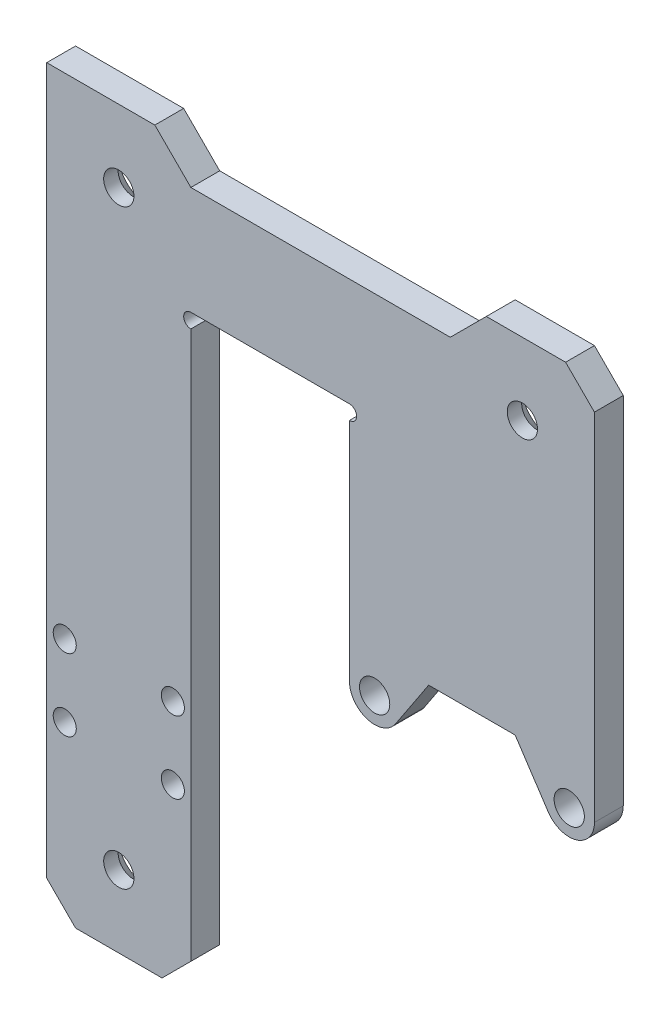
ISO-10303-21;
HEADER;
FILE_DESCRIPTION(('STEP AP214'),'2;1');
FILE_NAME('part.step','',(''),(''),'','','');
FILE_SCHEMA(('AUTOMOTIVE_DESIGN { 1 0 10303 214 1 1 1 1 }'));
ENDSEC;
DATA;
#1=APPLICATION_CONTEXT('core data for automotive mechanical design processes');
#2=APPLICATION_PROTOCOL_DEFINITION('international standard','automotive_design',2000,#1);
#3=PRODUCT_CONTEXT('',#1,'mechanical');
#4=PRODUCT('Part','Part','',(#3));
#5=PRODUCT_RELATED_PRODUCT_CATEGORY('part','',(#4));
#6=PRODUCT_DEFINITION_FORMATION('','',#4);
#7=PRODUCT_DEFINITION_CONTEXT('part definition',#1,'design');
#8=PRODUCT_DEFINITION('design','',#6,#7);
#9=PRODUCT_DEFINITION_SHAPE('','',#8);
#10=(LENGTH_UNIT() NAMED_UNIT(*) SI_UNIT(.MILLI.,.METRE.));
#11=(NAMED_UNIT(*) PLANE_ANGLE_UNIT() SI_UNIT($,.RADIAN.));
#12=(NAMED_UNIT(*) SI_UNIT($,.STERADIAN.) SOLID_ANGLE_UNIT());
#13=UNCERTAINTY_MEASURE_WITH_UNIT(LENGTH_MEASURE(1.E-05),#10,'distance_accuracy_value','');
#14=(GEOMETRIC_REPRESENTATION_CONTEXT(3) GLOBAL_UNCERTAINTY_ASSIGNED_CONTEXT((#13)) GLOBAL_UNIT_ASSIGNED_CONTEXT((#10,
#11,#12)) REPRESENTATION_CONTEXT('',''));
#15=CARTESIAN_POINT('',(0.,0.,0.));
#16=DIRECTION('',(0.,0.,1.));
#17=DIRECTION('',(1.,0.,0.));
#18=AXIS2_PLACEMENT_3D('',#15,#16,#17);
#19=CARTESIAN_POINT('',(45.,20.,2.));
#20=DIRECTION('',(0.,-1.,0.));
#21=DIRECTION('',(1.,0.,0.));
#22=AXIS2_PLACEMENT_3D('',#19,#20,#21);
#23=PLANE('',#22);
#24=DIRECTION('',(-1.,0.,0.));
#25=VECTOR('',#24,1.);
#26=CARTESIAN_POINT('',(45.,20.,2.));
#27=LINE('',#26,#25);
#28=CARTESIAN_POINT('',(41.,20.,2.));
#29=VERTEX_POINT('',#28);
#30=CARTESIAN_POINT('',(30.0000000000001,20.,2.));
#31=VERTEX_POINT('',#30);
#32=EDGE_CURVE('E265',#29,#31,#27,.T.);
#33=ORIENTED_EDGE('',*,*,#32,.F.);
#34=DIRECTION('',(0.,0.,-1.));
#35=VECTOR('',#34,1.);
#36=CARTESIAN_POINT('',(41.,20.,2.));
#37=LINE('',#36,#35);
#38=CARTESIAN_POINT('',(41.,20.,-2.));
#39=VERTEX_POINT('',#38);
#40=EDGE_CURVE('E48',#29,#39,#37,.T.);
#41=ORIENTED_EDGE('',*,*,#40,.T.);
#42=DIRECTION('',(-1.,0.,0.));
#43=VECTOR('',#42,1.);
#44=CARTESIAN_POINT('',(45.,20.,-2.));
#45=LINE('',#44,#43);
#46=CARTESIAN_POINT('',(30.0000000000001,20.,-2.));
#47=VERTEX_POINT('',#46);
#48=EDGE_CURVE('E263',#39,#47,#45,.T.);
#49=ORIENTED_EDGE('',*,*,#48,.T.);
#50=DIRECTION('',(0.,0.,1.));
#51=VECTOR('',#50,1.);
#52=CARTESIAN_POINT('',(30.0000000000001,20.,-2.));
#53=LINE('',#52,#51);
#54=EDGE_CURVE('E502',#47,#31,#53,.T.);
#55=ORIENTED_EDGE('',*,*,#54,.T.);
#56=EDGE_LOOP('',(#33,#41,#49,#55));
#57=FACE_BOUND('',#56,.T.);
#58=ADVANCED_FACE('F39',(#57),#23,.F.);
#59=CARTESIAN_POINT('',(41.5,-33.3065622090011,2.));
#60=DIRECTION('',(0.,0.,1.));
#61=DIRECTION('',(1.,0.,0.));
#62=AXIS2_PLACEMENT_3D('',#59,#60,#61);
#63=PLANE('',#62);
#64=CARTESIAN_POINT('',(-13.5,-58.,2.));
#65=DIRECTION('',(0.,0.,1.));
#66=DIRECTION('',(1.,0.,0.));
#67=AXIS2_PLACEMENT_3D('',#64,#65,#66);
#68=CIRCLE('',#67,1.6);
#69=CARTESIAN_POINT('',(-11.9,-58.,2.));
#70=VERTEX_POINT('',#69);
#71=EDGE_CURVE('E779',#70,#70,#68,.T.);
#72=ORIENTED_EDGE('',*,*,#71,.F.);
#73=EDGE_LOOP('',(#72));
#74=FACE_BOUND('',#73,.T.);
#75=CARTESIAN_POINT('',(-13.5,-48.,2.));
#76=DIRECTION('',(0.,0.,1.));
#77=DIRECTION('',(1.,0.,0.));
#78=AXIS2_PLACEMENT_3D('',#75,#76,#77);
#79=CIRCLE('',#78,1.6);
#80=CARTESIAN_POINT('',(-11.9,-48.,2.));
#81=VERTEX_POINT('',#80);
#82=EDGE_CURVE('E781',#81,#81,#79,.T.);
#83=ORIENTED_EDGE('',*,*,#82,.F.);
#84=EDGE_LOOP('',(#83));
#85=FACE_BOUND('',#84,.T.);
#86=CARTESIAN_POINT('',(-28.5,-48.,2.));
#87=DIRECTION('',(0.,0.,1.));
#88=DIRECTION('',(1.,0.,0.));
#89=AXIS2_PLACEMENT_3D('',#86,#87,#88);
#90=CIRCLE('',#89,1.6);
#91=CARTESIAN_POINT('',(-26.9,-48.,2.));
#92=VERTEX_POINT('',#91);
#93=EDGE_CURVE('E792',#92,#92,#90,.T.);
#94=ORIENTED_EDGE('',*,*,#93,.F.);
#95=EDGE_LOOP('',(#94));
#96=FACE_BOUND('',#95,.T.);
#97=CARTESIAN_POINT('',(-28.5,-58.,2.));
#98=DIRECTION('',(0.,0.,1.));
#99=DIRECTION('',(1.,0.,0.));
#100=AXIS2_PLACEMENT_3D('',#97,#98,#99);
#101=CIRCLE('',#100,1.6);
#102=CARTESIAN_POINT('',(-26.9,-58.,2.));
#103=VERTEX_POINT('',#102);
#104=EDGE_CURVE('E484',#103,#103,#101,.T.);
#105=ORIENTED_EDGE('',*,*,#104,.F.);
#106=EDGE_LOOP('',(#105));
#107=FACE_BOUND('',#106,.T.);
#108=DIRECTION('',(0.,-1.,0.));
#109=VECTOR('',#108,1.);
#110=CARTESIAN_POINT('',(-31.,20.,2.));
#111=LINE('',#110,#109);
#112=CARTESIAN_POINT('',(-31.,20.,2.));
#113=VERTEX_POINT('',#112);
#114=CARTESIAN_POINT('',(-31.,-78.,2.));
#115=VERTEX_POINT('',#114);
#116=EDGE_CURVE('E378',#113,#115,#111,.T.);
#117=ORIENTED_EDGE('',*,*,#116,.T.);
#118=DIRECTION('',(-0.707106781186546,0.707106781186549,0.));
#119=VECTOR('',#118,1.);
#120=CARTESIAN_POINT('',(-17.0967188954995,-91.9032811045005,2.));
#121=LINE('',#120,#119);
#122=CARTESIAN_POINT('',(-27.,-82.,2.));
#123=VERTEX_POINT('',#122);
#124=EDGE_CURVE('E254',#115,#123,#121,.F.);
#125=ORIENTED_EDGE('',*,*,#124,.T.);
#126=DIRECTION('',(1.,0.,0.));
#127=VECTOR('',#126,1.);
#128=CARTESIAN_POINT('',(-31.,-82.,2.));
#129=LINE('',#128,#127);
#130=CARTESIAN_POINT('',(-15.,-82.,2.));
#131=VERTEX_POINT('',#130);
#132=EDGE_CURVE('E293',#123,#131,#129,.T.);
#133=ORIENTED_EDGE('',*,*,#132,.T.);
#134=DIRECTION('',(-0.707106781186549,-0.707106781186546,0.));
#135=VECTOR('',#134,1.);
#136=CARTESIAN_POINT('',(37.5967188954995,-29.4032811045006,2.));
#137=LINE('',#136,#135);
#138=CARTESIAN_POINT('',(-11.,-78.,2.));
#139=VERTEX_POINT('',#138);
#140=EDGE_CURVE('E55',#131,#139,#137,.F.);
#141=ORIENTED_EDGE('',*,*,#140,.T.);
#142=DIRECTION('',(0.,1.,0.));
#143=VECTOR('',#142,1.);
#144=CARTESIAN_POINT('',(-11.,0.,2.));
#145=LINE('',#144,#143);
#146=CARTESIAN_POINT('',(-11.,-2.,2.));
#147=VERTEX_POINT('',#146);
#148=EDGE_CURVE('E205',#139,#147,#145,.T.);
#149=ORIENTED_EDGE('',*,*,#148,.T.);
#150=CARTESIAN_POINT('',(-11.,-1.,2.));
#151=DIRECTION('',(0.,0.,1.));
#152=DIRECTION('',(1.,0.,0.));
#153=AXIS2_PLACEMENT_3D('',#150,#151,#152);
#154=CIRCLE('',#153,1.);
#155=CARTESIAN_POINT('',(-11.,0.,2.));
#156=VERTEX_POINT('',#155);
#157=EDGE_CURVE('E201',#156,#147,#154,.T.);
#158=ORIENTED_EDGE('',*,*,#157,.F.);
#159=DIRECTION('',(1.,0.,0.));
#160=VECTOR('',#159,1.);
#161=CARTESIAN_POINT('',(11.,0.,2.));
#162=LINE('',#161,#160);
#163=CARTESIAN_POINT('',(11.,0.,2.));
#164=VERTEX_POINT('',#163);
#165=EDGE_CURVE('E196',#156,#164,#162,.T.);
#166=ORIENTED_EDGE('',*,*,#165,.T.);
#167=CARTESIAN_POINT('',(11.,-0.999999999999996,2.));
#168=DIRECTION('',(0.,0.,1.));
#169=DIRECTION('',(1.,0.,0.));
#170=AXIS2_PLACEMENT_3D('',#167,#168,#169);
#171=CIRCLE('',#170,1.);
#172=CARTESIAN_POINT('',(11.,-2.,2.));
#173=VERTEX_POINT('',#172);
#174=EDGE_CURVE('E182',#173,#164,#171,.T.);
#175=ORIENTED_EDGE('',*,*,#174,.F.);
#176=DIRECTION('',(0.,-1.,0.));
#177=VECTOR('',#176,1.);
#178=CARTESIAN_POINT('',(11.,0.,2.));
#179=LINE('',#178,#177);
#180=CARTESIAN_POINT('',(11.,-33.3065622090011,2.));
#181=VERTEX_POINT('',#180);
#182=EDGE_CURVE('E204',#173,#181,#179,.T.);
#183=ORIENTED_EDGE('',*,*,#182,.T.);
#184=CARTESIAN_POINT('',(14.5,-33.3065622090011,2.));
#185=DIRECTION('',(0.,0.,1.));
#186=DIRECTION('',(1.,0.,0.));
#187=AXIS2_PLACEMENT_3D('',#184,#185,#186);
#188=CIRCLE('',#187,3.5);
#189=CARTESIAN_POINT('',(17.4198882166285,-35.2363945339439,2.));
#190=VERTEX_POINT('',#189);
#191=EDGE_CURVE('E392',#181,#190,#188,.T.);
#192=ORIENTED_EDGE('',*,*,#191,.T.);
#193=DIRECTION('',(0.551380664269361,0.834253776179574,0.));
#194=VECTOR('',#193,1.);
#195=CARTESIAN_POINT('',(17.4198882166285,-35.2363945339439,2.));
#196=LINE('',#195,#194);
#197=CARTESIAN_POINT('',(22.,-28.3065622090011,2.));
#198=VERTEX_POINT('',#197);
#199=EDGE_CURVE('E312',#190,#198,#196,.T.);
#200=ORIENTED_EDGE('',*,*,#199,.T.);
#201=DIRECTION('',(1.,0.,0.));
#202=VECTOR('',#201,1.);
#203=CARTESIAN_POINT('',(22.,-28.3065622090011,2.));
#204=LINE('',#203,#202);
#205=CARTESIAN_POINT('',(34.,-28.3065622090011,2.));
#206=VERTEX_POINT('',#205);
#207=EDGE_CURVE('E394',#198,#206,#204,.T.);
#208=ORIENTED_EDGE('',*,*,#207,.T.);
#209=DIRECTION('',(0.551380664269361,-0.834253776179574,0.));
#210=VECTOR('',#209,1.);
#211=CARTESIAN_POINT('',(38.5801117833715,-35.2363945339439,2.));
#212=LINE('',#211,#210);
#213=CARTESIAN_POINT('',(38.5801117833715,-35.2363945339439,2.));
#214=VERTEX_POINT('',#213);
#215=EDGE_CURVE('E399',#206,#214,#212,.T.);
#216=ORIENTED_EDGE('',*,*,#215,.T.);
#217=CARTESIAN_POINT('',(41.5,-33.3065622090011,2.));
#218=DIRECTION('',(0.,0.,1.));
#219=DIRECTION('',(1.,0.,0.));
#220=AXIS2_PLACEMENT_3D('',#217,#218,#219);
#221=CIRCLE('',#220,3.5);
#222=CARTESIAN_POINT('',(45.,-33.3065622090011,2.));
#223=VERTEX_POINT('',#222);
#224=EDGE_CURVE('E379',#214,#223,#221,.T.);
#225=ORIENTED_EDGE('',*,*,#224,.T.);
#226=DIRECTION('',(0.,1.,0.));
#227=VECTOR('',#226,1.);
#228=CARTESIAN_POINT('',(45.,-33.3065622090011,2.));
#229=LINE('',#228,#227);
#230=CARTESIAN_POINT('',(45.,16.,2.));
#231=VERTEX_POINT('',#230);
#232=EDGE_CURVE('E376',#223,#231,#229,.T.);
#233=ORIENTED_EDGE('',*,*,#232,.T.);
#234=DIRECTION('',(0.707106781186546,-0.707106781186549,0.));
#235=VECTOR('',#234,1.);
#236=CARTESIAN_POINT('',(67.9032811045006,-6.90328110450067,2.));
#237=LINE('',#236,#235);
#238=EDGE_CURVE('E62',#231,#29,#237,.F.);
#239=ORIENTED_EDGE('',*,*,#238,.T.);
#240=ORIENTED_EDGE('',*,*,#32,.T.);
#241=DIRECTION('',(0.707106781186552,0.707106781186543,0.));
#242=VECTOR('',#241,1.);
#243=CARTESIAN_POINT('',(25.,15.,2.));
#244=LINE('',#243,#242);
#245=CARTESIAN_POINT('',(25.,15.,2.));
#246=VERTEX_POINT('',#245);
#247=EDGE_CURVE('E492',#246,#31,#244,.T.);
#248=ORIENTED_EDGE('',*,*,#247,.F.);
#249=DIRECTION('',(1.,0.,0.));
#250=VECTOR('',#249,1.);
#251=CARTESIAN_POINT('',(-11.,15.,2.));
#252=LINE('',#251,#250);
#253=CARTESIAN_POINT('',(-11.,15.,2.));
#254=VERTEX_POINT('',#253);
#255=EDGE_CURVE('E497',#254,#246,#252,.T.);
#256=ORIENTED_EDGE('',*,*,#255,.F.);
#257=DIRECTION('',(0.707106781186552,-0.707106781186544,0.));
#258=VECTOR('',#257,1.);
#259=CARTESIAN_POINT('',(-16.0000000000001,20.,2.));
#260=LINE('',#259,#258);
#261=CARTESIAN_POINT('',(-16.0000000000001,20.,2.));
#262=VERTEX_POINT('',#261);
#263=EDGE_CURVE('E480',#262,#254,#260,.T.);
#264=ORIENTED_EDGE('',*,*,#263,.F.);
#265=EDGE_CURVE('E371',#262,#113,#27,.T.);
#266=ORIENTED_EDGE('',*,*,#265,.T.);
#267=EDGE_LOOP('',(#117,#125,#133,#141,#149,#158,#166,#175,#183,#192,#200,#208,#216,#225,#233,
#239,#240,#248,#256,#264,#266));
#268=FACE_BOUND('',#267,.T.);
#269=CARTESIAN_POINT('',(41.5,-33.3065622090011,2.));
#270=DIRECTION('',(0.,0.,1.));
#271=DIRECTION('',(1.,0.,0.));
#272=AXIS2_PLACEMENT_3D('',#269,#270,#271);
#273=CIRCLE('',#272,2.1);
#274=CARTESIAN_POINT('',(43.6,-33.3065622090011,2.));
#275=VERTEX_POINT('',#274);
#276=EDGE_CURVE('E513',#275,#275,#273,.T.);
#277=ORIENTED_EDGE('',*,*,#276,.F.);
#278=EDGE_LOOP('',(#277));
#279=FACE_BOUND('',#278,.T.);
#280=CARTESIAN_POINT('',(35.,10.,2.));
#281=DIRECTION('',(0.,0.,1.));
#282=DIRECTION('',(1.,0.,0.));
#283=AXIS2_PLACEMENT_3D('',#280,#281,#282);
#284=CIRCLE('',#283,2.1);
#285=CARTESIAN_POINT('',(37.1,10.,2.));
#286=VERTEX_POINT('',#285);
#287=EDGE_CURVE('E522',#286,#286,#284,.T.);
#288=ORIENTED_EDGE('',*,*,#287,.F.);
#289=EDGE_LOOP('',(#288));
#290=FACE_BOUND('',#289,.T.);
#291=CARTESIAN_POINT('',(-21.,10.,2.));
#292=DIRECTION('',(0.,0.,1.));
#293=DIRECTION('',(1.,0.,0.));
#294=AXIS2_PLACEMENT_3D('',#291,#292,#293);
#295=CIRCLE('',#294,2.1);
#296=CARTESIAN_POINT('',(-18.9,10.,2.));
#297=VERTEX_POINT('',#296);
#298=EDGE_CURVE('E387',#297,#297,#295,.T.);
#299=ORIENTED_EDGE('',*,*,#298,.F.);
#300=EDGE_LOOP('',(#299));
#301=FACE_BOUND('',#300,.T.);
#302=CARTESIAN_POINT('',(14.5,-33.3065622090011,2.));
#303=DIRECTION('',(0.,0.,1.));
#304=DIRECTION('',(1.,0.,0.));
#305=AXIS2_PLACEMENT_3D('',#302,#303,#304);
#306=CIRCLE('',#305,2.09999999999999);
#307=CARTESIAN_POINT('',(16.6,-33.3065622090011,2.));
#308=VERTEX_POINT('',#307);
#309=EDGE_CURVE('E519',#308,#308,#306,.T.);
#310=ORIENTED_EDGE('',*,*,#309,.F.);
#311=EDGE_LOOP('',(#310));
#312=FACE_BOUND('',#311,.T.);
#313=CARTESIAN_POINT('',(-21.,-72.,2.));
#314=DIRECTION('',(0.,0.,1.));
#315=DIRECTION('',(1.,0.,0.));
#316=AXIS2_PLACEMENT_3D('',#313,#314,#315);
#317=CIRCLE('',#316,2.1);
#318=CARTESIAN_POINT('',(-18.9,-72.,2.));
#319=VERTEX_POINT('',#318);
#320=EDGE_CURVE('E504',#319,#319,#317,.T.);
#321=ORIENTED_EDGE('',*,*,#320,.F.);
#322=EDGE_LOOP('',(#321));
#323=FACE_BOUND('',#322,.T.);
#324=ADVANCED_FACE('F198',(#74,#85,#96,#107,#268,#279,#290,#301,#312,#323),#63,.T.);
#325=CARTESIAN_POINT('',(41.5,-33.3065622090011,-2.));
#326=DIRECTION('',(0.,0.,1.));
#327=DIRECTION('',(1.,0.,0.));
#328=AXIS2_PLACEMENT_3D('',#325,#326,#327);
#329=PLANE('',#328);
#330=CARTESIAN_POINT('',(-13.5,-58.,-2.));
#331=DIRECTION('',(0.,0.,1.));
#332=DIRECTION('',(1.,0.,0.));
#333=AXIS2_PLACEMENT_3D('',#330,#331,#332);
#334=CIRCLE('',#333,1.6);
#335=CARTESIAN_POINT('',(-11.9,-58.,-2.));
#336=VERTEX_POINT('',#335);
#337=EDGE_CURVE('E776',#336,#336,#334,.T.);
#338=ORIENTED_EDGE('',*,*,#337,.T.);
#339=EDGE_LOOP('',(#338));
#340=FACE_BOUND('',#339,.T.);
#341=CARTESIAN_POINT('',(-13.5,-48.,-2.));
#342=DIRECTION('',(0.,0.,1.));
#343=DIRECTION('',(1.,0.,0.));
#344=AXIS2_PLACEMENT_3D('',#341,#342,#343);
#345=CIRCLE('',#344,1.6);
#346=CARTESIAN_POINT('',(-11.9,-48.,-2.));
#347=VERTEX_POINT('',#346);
#348=EDGE_CURVE('E797',#347,#347,#345,.T.);
#349=ORIENTED_EDGE('',*,*,#348,.T.);
#350=EDGE_LOOP('',(#349));
#351=FACE_BOUND('',#350,.T.);
#352=CARTESIAN_POINT('',(-28.5,-48.,-2.));
#353=DIRECTION('',(0.,0.,1.));
#354=DIRECTION('',(1.,0.,0.));
#355=AXIS2_PLACEMENT_3D('',#352,#353,#354);
#356=CIRCLE('',#355,1.6);
#357=CARTESIAN_POINT('',(-26.9,-48.,-2.));
#358=VERTEX_POINT('',#357);
#359=EDGE_CURVE('E788',#358,#358,#356,.T.);
#360=ORIENTED_EDGE('',*,*,#359,.T.);
#361=EDGE_LOOP('',(#360));
#362=FACE_BOUND('',#361,.T.);
#363=CARTESIAN_POINT('',(-28.5,-58.,-2.));
#364=DIRECTION('',(0.,0.,1.));
#365=DIRECTION('',(1.,0.,0.));
#366=AXIS2_PLACEMENT_3D('',#363,#364,#365);
#367=CIRCLE('',#366,1.6);
#368=CARTESIAN_POINT('',(-26.9,-58.,-2.));
#369=VERTEX_POINT('',#368);
#370=EDGE_CURVE('E192',#369,#369,#367,.T.);
#371=ORIENTED_EDGE('',*,*,#370,.T.);
#372=EDGE_LOOP('',(#371));
#373=FACE_BOUND('',#372,.T.);
#374=CARTESIAN_POINT('',(35.,10.,-2.));
#375=DIRECTION('',(0.,0.,1.));
#376=DIRECTION('',(1.,0.,0.));
#377=AXIS2_PLACEMENT_3D('',#374,#375,#376);
#378=CIRCLE('',#377,4.09999999999998);
#379=CARTESIAN_POINT('',(39.1,10.,-2.));
#380=VERTEX_POINT('',#379);
#381=EDGE_CURVE('E226',#380,#380,#378,.T.);
#382=ORIENTED_EDGE('',*,*,#381,.T.);
#383=EDGE_LOOP('',(#382));
#384=FACE_BOUND('',#383,.T.);
#385=CARTESIAN_POINT('',(-21.,10.,-2.));
#386=DIRECTION('',(0.,0.,1.));
#387=DIRECTION('',(1.,0.,0.));
#388=AXIS2_PLACEMENT_3D('',#385,#386,#387);
#389=CIRCLE('',#388,4.09999999999999);
#390=CARTESIAN_POINT('',(-16.9,10.,-2.));
#391=VERTEX_POINT('',#390);
#392=EDGE_CURVE('E223',#391,#391,#389,.T.);
#393=ORIENTED_EDGE('',*,*,#392,.T.);
#394=EDGE_LOOP('',(#393));
#395=FACE_BOUND('',#394,.T.);
#396=CARTESIAN_POINT('',(-21.,-72.,-2.));
#397=DIRECTION('',(0.,0.,1.));
#398=DIRECTION('',(1.,0.,0.));
#399=AXIS2_PLACEMENT_3D('',#396,#397,#398);
#400=CIRCLE('',#399,4.09999999999999);
#401=CARTESIAN_POINT('',(-16.9,-72.,-2.));
#402=VERTEX_POINT('',#401);
#403=EDGE_CURVE('E214',#402,#402,#400,.T.);
#404=ORIENTED_EDGE('',*,*,#403,.T.);
#405=EDGE_LOOP('',(#404));
#406=FACE_BOUND('',#405,.T.);
#407=DIRECTION('',(1.,0.,0.));
#408=VECTOR('',#407,1.);
#409=CARTESIAN_POINT('',(-31.,-82.,-2.));
#410=LINE('',#409,#408);
#411=CARTESIAN_POINT('',(-27.,-82.,-2.));
#412=VERTEX_POINT('',#411);
#413=CARTESIAN_POINT('',(-15.,-82.,-2.));
#414=VERTEX_POINT('',#413);
#415=EDGE_CURVE('E281',#412,#414,#410,.T.);
#416=ORIENTED_EDGE('',*,*,#415,.F.);
#417=DIRECTION('',(0.707106781186546,-0.707106781186549,0.));
#418=VECTOR('',#417,1.);
#419=CARTESIAN_POINT('',(-27.,-82.,-2.));
#420=LINE('',#419,#418);
#421=CARTESIAN_POINT('',(-31.,-78.,-2.));
#422=VERTEX_POINT('',#421);
#423=EDGE_CURVE('E248',#412,#422,#420,.F.);
#424=ORIENTED_EDGE('',*,*,#423,.T.);
#425=DIRECTION('',(0.,-1.,0.));
#426=VECTOR('',#425,1.);
#427=CARTESIAN_POINT('',(-31.,20.,-2.));
#428=LINE('',#427,#426);
#429=CARTESIAN_POINT('',(-31.,20.,-2.));
#430=VERTEX_POINT('',#429);
#431=EDGE_CURVE('E277',#430,#422,#428,.T.);
#432=ORIENTED_EDGE('',*,*,#431,.F.);
#433=CARTESIAN_POINT('',(-16.0000000000001,20.,-2.));
#434=VERTEX_POINT('',#433);
#435=EDGE_CURVE('E278',#434,#430,#45,.T.);
#436=ORIENTED_EDGE('',*,*,#435,.F.);
#437=DIRECTION('',(0.707106781186552,-0.707106781186544,0.));
#438=VECTOR('',#437,1.);
#439=CARTESIAN_POINT('',(-16.0000000000001,20.,-2.));
#440=LINE('',#439,#438);
#441=CARTESIAN_POINT('',(-11.,15.,-2.));
#442=VERTEX_POINT('',#441);
#443=EDGE_CURVE('E488',#434,#442,#440,.T.);
#444=ORIENTED_EDGE('',*,*,#443,.T.);
#445=DIRECTION('',(1.,0.,0.));
#446=VECTOR('',#445,1.);
#447=CARTESIAN_POINT('',(-11.,15.,-2.));
#448=LINE('',#447,#446);
#449=CARTESIAN_POINT('',(25.,15.,-2.));
#450=VERTEX_POINT('',#449);
#451=EDGE_CURVE('E491',#442,#450,#448,.T.);
#452=ORIENTED_EDGE('',*,*,#451,.T.);
#453=DIRECTION('',(0.707106781186552,0.707106781186543,0.));
#454=VECTOR('',#453,1.);
#455=CARTESIAN_POINT('',(25.,15.,-2.));
#456=LINE('',#455,#454);
#457=EDGE_CURVE('E276',#450,#47,#456,.T.);
#458=ORIENTED_EDGE('',*,*,#457,.T.);
#459=ORIENTED_EDGE('',*,*,#48,.F.);
#460=DIRECTION('',(-0.707106781186546,0.707106781186549,0.));
#461=VECTOR('',#460,1.);
#462=CARTESIAN_POINT('',(41.,20.,-2.));
#463=LINE('',#462,#461);
#464=CARTESIAN_POINT('',(45.,16.,-2.));
#465=VERTEX_POINT('',#464);
#466=EDGE_CURVE('E244',#39,#465,#463,.F.);
#467=ORIENTED_EDGE('',*,*,#466,.T.);
#468=DIRECTION('',(0.,1.,0.));
#469=VECTOR('',#468,1.);
#470=CARTESIAN_POINT('',(45.,-33.3065622090011,-2.));
#471=LINE('',#470,#469);
#472=CARTESIAN_POINT('',(45.,-33.3065622090011,-2.));
#473=VERTEX_POINT('',#472);
#474=EDGE_CURVE('E283',#473,#465,#471,.T.);
#475=ORIENTED_EDGE('',*,*,#474,.F.);
#476=CARTESIAN_POINT('',(41.5,-33.3065622090011,-2.));
#477=DIRECTION('',(0.,0.,1.));
#478=DIRECTION('',(1.,0.,0.));
#479=AXIS2_PLACEMENT_3D('',#476,#477,#478);
#480=CIRCLE('',#479,3.5);
#481=CARTESIAN_POINT('',(38.5801117833715,-35.2363945339439,-2.));
#482=VERTEX_POINT('',#481);
#483=EDGE_CURVE('E328',#482,#473,#480,.T.);
#484=ORIENTED_EDGE('',*,*,#483,.F.);
#485=DIRECTION('',(0.551380664269361,-0.834253776179574,0.));
#486=VECTOR('',#485,1.);
#487=CARTESIAN_POINT('',(38.5801117833715,-35.2363945339439,-2.));
#488=LINE('',#487,#486);
#489=CARTESIAN_POINT('',(34.,-28.3065622090011,-2.));
#490=VERTEX_POINT('',#489);
#491=EDGE_CURVE('E322',#490,#482,#488,.T.);
#492=ORIENTED_EDGE('',*,*,#491,.F.);
#493=DIRECTION('',(1.,0.,0.));
#494=VECTOR('',#493,1.);
#495=CARTESIAN_POINT('',(22.,-28.3065622090011,-2.));
#496=LINE('',#495,#494);
#497=CARTESIAN_POINT('',(22.,-28.3065622090011,-2.));
#498=VERTEX_POINT('',#497);
#499=EDGE_CURVE('E320',#498,#490,#496,.T.);
#500=ORIENTED_EDGE('',*,*,#499,.F.);
#501=DIRECTION('',(0.551380664269361,0.834253776179574,0.));
#502=VECTOR('',#501,1.);
#503=CARTESIAN_POINT('',(17.4198882166285,-35.2363945339439,-2.));
#504=LINE('',#503,#502);
#505=CARTESIAN_POINT('',(17.4198882166285,-35.2363945339439,-2.));
#506=VERTEX_POINT('',#505);
#507=EDGE_CURVE('E311',#506,#498,#504,.T.);
#508=ORIENTED_EDGE('',*,*,#507,.F.);
#509=CARTESIAN_POINT('',(14.5,-33.3065622090011,-2.));
#510=DIRECTION('',(0.,0.,1.));
#511=DIRECTION('',(1.,0.,0.));
#512=AXIS2_PLACEMENT_3D('',#509,#510,#511);
#513=CIRCLE('',#512,3.5);
#514=CARTESIAN_POINT('',(11.,-33.3065622090011,-2.));
#515=VERTEX_POINT('',#514);
#516=EDGE_CURVE('E318',#515,#506,#513,.T.);
#517=ORIENTED_EDGE('',*,*,#516,.F.);
#518=DIRECTION('',(0.,-1.,0.));
#519=VECTOR('',#518,1.);
#520=CARTESIAN_POINT('',(11.,0.,-2.));
#521=LINE('',#520,#519);
#522=CARTESIAN_POINT('',(11.,-2.,-2.));
#523=VERTEX_POINT('',#522);
#524=EDGE_CURVE('E324',#523,#515,#521,.T.);
#525=ORIENTED_EDGE('',*,*,#524,.F.);
#526=CARTESIAN_POINT('',(11.,-0.999999999999996,-2.));
#527=DIRECTION('',(0.,0.,1.));
#528=DIRECTION('',(1.,0.,0.));
#529=AXIS2_PLACEMENT_3D('',#526,#527,#528);
#530=CIRCLE('',#529,1.);
#531=CARTESIAN_POINT('',(11.,0.,-2.));
#532=VERTEX_POINT('',#531);
#533=EDGE_CURVE('E191',#523,#532,#530,.T.);
#534=ORIENTED_EDGE('',*,*,#533,.T.);
#535=DIRECTION('',(1.,0.,0.));
#536=VECTOR('',#535,1.);
#537=CARTESIAN_POINT('',(11.,0.,-2.));
#538=LINE('',#537,#536);
#539=CARTESIAN_POINT('',(-11.,0.,-2.));
#540=VERTEX_POINT('',#539);
#541=EDGE_CURVE('E210',#540,#532,#538,.T.);
#542=ORIENTED_EDGE('',*,*,#541,.F.);
#543=CARTESIAN_POINT('',(-11.,-1.,-2.));
#544=DIRECTION('',(0.,0.,1.));
#545=DIRECTION('',(1.,0.,0.));
#546=AXIS2_PLACEMENT_3D('',#543,#544,#545);
#547=CIRCLE('',#546,1.);
#548=CARTESIAN_POINT('',(-11.,-2.,-2.));
#549=VERTEX_POINT('',#548);
#550=EDGE_CURVE('E477',#540,#549,#547,.T.);
#551=ORIENTED_EDGE('',*,*,#550,.T.);
#552=DIRECTION('',(0.,1.,0.));
#553=VECTOR('',#552,1.);
#554=CARTESIAN_POINT('',(-11.,0.,-2.));
#555=LINE('',#554,#553);
#556=CARTESIAN_POINT('',(-11.,-78.,-2.));
#557=VERTEX_POINT('',#556);
#558=EDGE_CURVE('E385',#557,#549,#555,.T.);
#559=ORIENTED_EDGE('',*,*,#558,.F.);
#560=DIRECTION('',(0.707106781186549,0.707106781186546,0.));
#561=VECTOR('',#560,1.);
#562=CARTESIAN_POINT('',(-11.,-78.,-2.));
#563=LINE('',#562,#561);
#564=EDGE_CURVE('E246',#557,#414,#563,.F.);
#565=ORIENTED_EDGE('',*,*,#564,.T.);
#566=EDGE_LOOP('',(#416,#424,#432,#436,#444,#452,#458,#459,#467,#475,#484,#492,#500,#508,#517,
#525,#534,#542,#551,#559,#565));
#567=FACE_BOUND('',#566,.T.);
#568=CARTESIAN_POINT('',(14.5,-33.3065622090011,-2.));
#569=DIRECTION('',(0.,0.,1.));
#570=DIRECTION('',(1.,0.,0.));
#571=AXIS2_PLACEMENT_3D('',#568,#569,#570);
#572=CIRCLE('',#571,2.09999999999999);
#573=CARTESIAN_POINT('',(16.6,-33.3065622090011,-2.));
#574=VERTEX_POINT('',#573);
#575=EDGE_CURVE('E516',#574,#574,#572,.T.);
#576=ORIENTED_EDGE('',*,*,#575,.T.);
#577=EDGE_LOOP('',(#576));
#578=FACE_BOUND('',#577,.T.);
#579=CARTESIAN_POINT('',(41.5,-33.3065622090011,-2.));
#580=DIRECTION('',(0.,0.,1.));
#581=DIRECTION('',(1.,0.,0.));
#582=AXIS2_PLACEMENT_3D('',#579,#580,#581);
#583=CIRCLE('',#582,2.1);
#584=CARTESIAN_POINT('',(43.6,-33.3065622090011,-2.));
#585=VERTEX_POINT('',#584);
#586=EDGE_CURVE('E512',#585,#585,#583,.T.);
#587=ORIENTED_EDGE('',*,*,#586,.T.);
#588=EDGE_LOOP('',(#587));
#589=FACE_BOUND('',#588,.T.);
#590=ADVANCED_FACE('F270',(#340,#351,#362,#373,#384,#395,#406,#567,#578,#589),#329,.F.);
#591=CARTESIAN_POINT('',(-11.,0.,2.));
#592=DIRECTION('',(-1.,0.,0.));
#593=DIRECTION('',(0.,-1.,0.));
#594=AXIS2_PLACEMENT_3D('',#591,#592,#593);
#595=PLANE('',#594);
#596=ORIENTED_EDGE('',*,*,#148,.F.);
#597=DIRECTION('',(0.,0.,-1.));
#598=VECTOR('',#597,1.);
#599=CARTESIAN_POINT('',(-11.,-78.,2.));
#600=LINE('',#599,#598);
#601=EDGE_CURVE('E256',#139,#557,#600,.T.);
#602=ORIENTED_EDGE('',*,*,#601,.T.);
#603=ORIENTED_EDGE('',*,*,#558,.T.);
#604=DIRECTION('',(0.,0.,1.));
#605=VECTOR('',#604,1.);
#606=CARTESIAN_POINT('',(-11.,-2.,-2.));
#607=LINE('',#606,#605);
#608=EDGE_CURVE('E478',#549,#147,#607,.T.);
#609=ORIENTED_EDGE('',*,*,#608,.T.);
#610=EDGE_LOOP('',(#596,#602,#603,#609));
#611=FACE_BOUND('',#610,.T.);
#612=ADVANCED_FACE('F424',(#611),#595,.F.);
#613=CARTESIAN_POINT('',(11.,0.,2.));
#614=DIRECTION('',(0.,1.,0.));
#615=DIRECTION('',(-1.,0.,0.));
#616=AXIS2_PLACEMENT_3D('',#613,#614,#615);
#617=PLANE('',#616);
#618=ORIENTED_EDGE('',*,*,#541,.T.);
#619=DIRECTION('',(0.,0.,-1.));
#620=VECTOR('',#619,1.);
#621=CARTESIAN_POINT('',(11.,0.,2.));
#622=LINE('',#621,#620);
#623=EDGE_CURVE('E186',#164,#532,#622,.T.);
#624=ORIENTED_EDGE('',*,*,#623,.F.);
#625=ORIENTED_EDGE('',*,*,#165,.F.);
#626=DIRECTION('',(0.,0.,-1.));
#627=VECTOR('',#626,1.);
#628=CARTESIAN_POINT('',(-11.,0.,2.));
#629=LINE('',#628,#627);
#630=EDGE_CURVE('E211',#156,#540,#629,.T.);
#631=ORIENTED_EDGE('',*,*,#630,.T.);
#632=EDGE_LOOP('',(#618,#624,#625,#631));
#633=FACE_BOUND('',#632,.T.);
#634=ADVANCED_FACE('F208',(#633),#617,.F.);
#635=CARTESIAN_POINT('',(11.,0.,2.));
#636=DIRECTION('',(1.,0.,0.));
#637=DIRECTION('',(0.,1.,0.));
#638=AXIS2_PLACEMENT_3D('',#635,#636,#637);
#639=PLANE('',#638);
#640=ORIENTED_EDGE('',*,*,#182,.F.);
#641=DIRECTION('',(0.,0.,1.));
#642=VECTOR('',#641,1.);
#643=CARTESIAN_POINT('',(11.,-2.,-2.));
#644=LINE('',#643,#642);
#645=EDGE_CURVE('E189',#173,#523,#644,.F.);
#646=ORIENTED_EDGE('',*,*,#645,.T.);
#647=ORIENTED_EDGE('',*,*,#524,.T.);
#648=DIRECTION('',(0.,0.,-1.));
#649=VECTOR('',#648,1.);
#650=CARTESIAN_POINT('',(11.,-33.3065622090011,2.));
#651=LINE('',#650,#649);
#652=EDGE_CURVE('E212',#181,#515,#651,.T.);
#653=ORIENTED_EDGE('',*,*,#652,.F.);
#654=EDGE_LOOP('',(#640,#646,#647,#653));
#655=FACE_BOUND('',#654,.T.);
#656=ADVANCED_FACE('F390',(#655),#639,.F.);
#657=CARTESIAN_POINT('',(14.5,-33.3065622090011,2.));
#658=DIRECTION('',(0.,0.,-1.));
#659=DIRECTION('',(-1.,0.,0.));
#660=AXIS2_PLACEMENT_3D('',#657,#658,#659);
#661=CYLINDRICAL_SURFACE('',#660,3.5);
#662=ORIENTED_EDGE('',*,*,#516,.T.);
#663=DIRECTION('',(0.,0.,-1.));
#664=VECTOR('',#663,1.);
#665=CARTESIAN_POINT('',(17.4198882166285,-35.2363945339439,2.));
#666=LINE('',#665,#664);
#667=EDGE_CURVE('E217',#190,#506,#666,.T.);
#668=ORIENTED_EDGE('',*,*,#667,.F.);
#669=ORIENTED_EDGE('',*,*,#191,.F.);
#670=ORIENTED_EDGE('',*,*,#652,.T.);
#671=EDGE_LOOP('',(#662,#668,#669,#670));
#672=FACE_BOUND('',#671,.T.);
#673=ADVANCED_FACE('F391',(#672),#661,.T.);
#674=CARTESIAN_POINT('',(17.4198882166285,-35.2363945339439,2.));
#675=DIRECTION('',(-0.834253776179574,0.551380664269361,0.));
#676=DIRECTION('',(-0.551380664269361,-0.834253776179574,0.));
#677=AXIS2_PLACEMENT_3D('',#674,#675,#676);
#678=PLANE('',#677);
#679=ORIENTED_EDGE('',*,*,#507,.T.);
#680=DIRECTION('',(0.,0.,-1.));
#681=VECTOR('',#680,1.);
#682=CARTESIAN_POINT('',(22.,-28.3065622090011,2.));
#683=LINE('',#682,#681);
#684=EDGE_CURVE('E302',#198,#498,#683,.T.);
#685=ORIENTED_EDGE('',*,*,#684,.F.);
#686=ORIENTED_EDGE('',*,*,#199,.F.);
#687=ORIENTED_EDGE('',*,*,#667,.T.);
#688=EDGE_LOOP('',(#679,#685,#686,#687));
#689=FACE_BOUND('',#688,.T.);
#690=ADVANCED_FACE('F309',(#689),#678,.F.);
#691=CARTESIAN_POINT('',(22.,-28.3065622090011,2.));
#692=DIRECTION('',(0.,1.,0.));
#693=DIRECTION('',(0.,0.,1.));
#694=AXIS2_PLACEMENT_3D('',#691,#692,#693);
#695=PLANE('',#694);
#696=ORIENTED_EDGE('',*,*,#499,.T.);
#697=DIRECTION('',(0.,0.,-1.));
#698=VECTOR('',#697,1.);
#699=CARTESIAN_POINT('',(34.,-28.3065622090011,2.));
#700=LINE('',#699,#698);
#701=EDGE_CURVE('E299',#206,#490,#700,.T.);
#702=ORIENTED_EDGE('',*,*,#701,.F.);
#703=ORIENTED_EDGE('',*,*,#207,.F.);
#704=ORIENTED_EDGE('',*,*,#684,.T.);
#705=EDGE_LOOP('',(#696,#702,#703,#704));
#706=FACE_BOUND('',#705,.T.);
#707=ADVANCED_FACE('F409',(#706),#695,.F.);
#708=CARTESIAN_POINT('',(38.5801117833715,-35.2363945339439,2.));
#709=DIRECTION('',(0.834253776179574,0.551380664269361,0.));
#710=DIRECTION('',(-0.551380664269361,0.834253776179574,0.));
#711=AXIS2_PLACEMENT_3D('',#708,#709,#710);
#712=PLANE('',#711);
#713=ORIENTED_EDGE('',*,*,#491,.T.);
#714=DIRECTION('',(0.,0.,-1.));
#715=VECTOR('',#714,1.);
#716=CARTESIAN_POINT('',(38.5801117833715,-35.2363945339439,2.));
#717=LINE('',#716,#715);
#718=EDGE_CURVE('E296',#214,#482,#717,.T.);
#719=ORIENTED_EDGE('',*,*,#718,.F.);
#720=ORIENTED_EDGE('',*,*,#215,.F.);
#721=ORIENTED_EDGE('',*,*,#701,.T.);
#722=EDGE_LOOP('',(#713,#719,#720,#721));
#723=FACE_BOUND('',#722,.T.);
#724=ADVANCED_FACE('F404',(#723),#712,.F.);
#725=CARTESIAN_POINT('',(41.5,-33.3065622090011,2.));
#726=DIRECTION('',(0.,0.,-1.));
#727=DIRECTION('',(-1.,0.,0.));
#728=AXIS2_PLACEMENT_3D('',#725,#726,#727);
#729=CYLINDRICAL_SURFACE('',#728,3.5);
#730=ORIENTED_EDGE('',*,*,#483,.T.);
#731=DIRECTION('',(0.,0.,-1.));
#732=VECTOR('',#731,1.);
#733=CARTESIAN_POINT('',(45.,-33.3065622090011,2.));
#734=LINE('',#733,#732);
#735=EDGE_CURVE('E292',#223,#473,#734,.T.);
#736=ORIENTED_EDGE('',*,*,#735,.F.);
#737=ORIENTED_EDGE('',*,*,#224,.F.);
#738=ORIENTED_EDGE('',*,*,#718,.T.);
#739=EDGE_LOOP('',(#730,#736,#737,#738));
#740=FACE_BOUND('',#739,.T.);
#741=ADVANCED_FACE('F367',(#740),#729,.T.);
#742=CARTESIAN_POINT('',(45.,-33.3065622090011,2.));
#743=DIRECTION('',(-1.,0.,0.));
#744=DIRECTION('',(0.,0.,1.));
#745=AXIS2_PLACEMENT_3D('',#742,#743,#744);
#746=PLANE('',#745);
#747=ORIENTED_EDGE('',*,*,#474,.T.);
#748=DIRECTION('',(0.,0.,1.));
#749=VECTOR('',#748,1.);
#750=CARTESIAN_POINT('',(45.,16.,2.));
#751=LINE('',#750,#749);
#752=EDGE_CURVE('E11',#465,#231,#751,.T.);
#753=ORIENTED_EDGE('',*,*,#752,.T.);
#754=ORIENTED_EDGE('',*,*,#232,.F.);
#755=ORIENTED_EDGE('',*,*,#735,.T.);
#756=EDGE_LOOP('',(#747,#753,#754,#755));
#757=FACE_BOUND('',#756,.T.);
#758=ADVANCED_FACE('F334',(#757),#746,.F.);
#759=ORIENTED_EDGE('',*,*,#265,.F.);
#760=DIRECTION('',(0.,0.,1.));
#761=VECTOR('',#760,1.);
#762=CARTESIAN_POINT('',(-16.0000000000001,20.,-2.));
#763=LINE('',#762,#761);
#764=EDGE_CURVE('E372',#434,#262,#763,.T.);
#765=ORIENTED_EDGE('',*,*,#764,.F.);
#766=ORIENTED_EDGE('',*,*,#435,.T.);
#767=DIRECTION('',(0.,0.,-1.));
#768=VECTOR('',#767,1.);
#769=CARTESIAN_POINT('',(-31.,20.,2.));
#770=LINE('',#769,#768);
#771=EDGE_CURVE('E289',#113,#430,#770,.T.);
#772=ORIENTED_EDGE('',*,*,#771,.F.);
#773=EDGE_LOOP('',(#759,#765,#766,#772));
#774=FACE_BOUND('',#773,.T.);
#775=ADVANCED_FACE('F350',(#774),#23,.F.);
#776=CARTESIAN_POINT('',(-31.,20.,2.));
#777=DIRECTION('',(1.,0.,0.));
#778=DIRECTION('',(0.,1.,0.));
#779=AXIS2_PLACEMENT_3D('',#776,#777,#778);
#780=PLANE('',#779);
#781=ORIENTED_EDGE('',*,*,#431,.T.);
#782=DIRECTION('',(0.,0.,1.));
#783=VECTOR('',#782,1.);
#784=CARTESIAN_POINT('',(-31.,-78.,2.));
#785=LINE('',#784,#783);
#786=EDGE_CURVE('E250',#422,#115,#785,.T.);
#787=ORIENTED_EDGE('',*,*,#786,.T.);
#788=ORIENTED_EDGE('',*,*,#116,.F.);
#789=ORIENTED_EDGE('',*,*,#771,.T.);
#790=EDGE_LOOP('',(#781,#787,#788,#789));
#791=FACE_BOUND('',#790,.T.);
#792=ADVANCED_FACE('F359',(#791),#780,.F.);
#793=CARTESIAN_POINT('',(-31.,-82.,2.));
#794=DIRECTION('',(0.,1.,0.));
#795=DIRECTION('',(0.,0.,1.));
#796=AXIS2_PLACEMENT_3D('',#793,#794,#795);
#797=PLANE('',#796);
#798=ORIENTED_EDGE('',*,*,#132,.F.);
#799=DIRECTION('',(0.,0.,-1.));
#800=VECTOR('',#799,1.);
#801=CARTESIAN_POINT('',(-27.,-82.,2.));
#802=LINE('',#801,#800);
#803=EDGE_CURVE('E241',#123,#412,#802,.T.);
#804=ORIENTED_EDGE('',*,*,#803,.T.);
#805=ORIENTED_EDGE('',*,*,#415,.T.);
#806=DIRECTION('',(0.,0.,1.));
#807=VECTOR('',#806,1.);
#808=CARTESIAN_POINT('',(-15.,-82.,2.));
#809=LINE('',#808,#807);
#810=EDGE_CURVE('E239',#414,#131,#809,.T.);
#811=ORIENTED_EDGE('',*,*,#810,.T.);
#812=EDGE_LOOP('',(#798,#804,#805,#811));
#813=FACE_BOUND('',#812,.T.);
#814=ADVANCED_FACE('F365',(#813),#797,.F.);
#815=CARTESIAN_POINT('',(-21.,10.,2.));
#816=DIRECTION('',(0.,0.,-1.));
#817=DIRECTION('',(-1.,0.,0.));
#818=AXIS2_PLACEMENT_3D('',#815,#816,#817);
#819=CYLINDRICAL_SURFACE('',#818,2.1);
#820=CARTESIAN_POINT('',(-21.,10.,0.));
#821=DIRECTION('',(0.,0.,1.));
#822=DIRECTION('',(1.,0.,0.));
#823=AXIS2_PLACEMENT_3D('',#820,#821,#822);
#824=CIRCLE('',#823,2.1);
#825=CARTESIAN_POINT('',(-18.9,10.,0.));
#826=VERTEX_POINT('',#825);
#827=EDGE_CURVE('E232',#826,#826,#824,.F.);
#828=ORIENTED_EDGE('',*,*,#827,.T.);
#829=EDGE_LOOP('',(#828));
#830=FACE_BOUND('',#829,.T.);
#831=ORIENTED_EDGE('',*,*,#298,.T.);
#832=EDGE_LOOP('',(#831));
#833=FACE_BOUND('',#832,.T.);
#834=ADVANCED_FACE('F531',(#830,#833),#819,.F.);
#835=CARTESIAN_POINT('',(35.,10.,2.));
#836=DIRECTION('',(0.,0.,-1.));
#837=DIRECTION('',(-1.,0.,0.));
#838=AXIS2_PLACEMENT_3D('',#835,#836,#837);
#839=CYLINDRICAL_SURFACE('',#838,2.1);
#840=CARTESIAN_POINT('',(35.,10.,0.));
#841=DIRECTION('',(0.,0.,1.));
#842=DIRECTION('',(1.,0.,0.));
#843=AXIS2_PLACEMENT_3D('',#840,#841,#842);
#844=CIRCLE('',#843,2.1);
#845=CARTESIAN_POINT('',(37.1,10.,0.));
#846=VERTEX_POINT('',#845);
#847=EDGE_CURVE('E229',#846,#846,#844,.F.);
#848=ORIENTED_EDGE('',*,*,#847,.T.);
#849=EDGE_LOOP('',(#848));
#850=FACE_BOUND('',#849,.T.);
#851=ORIENTED_EDGE('',*,*,#287,.T.);
#852=EDGE_LOOP('',(#851));
#853=FACE_BOUND('',#852,.T.);
#854=ADVANCED_FACE('F559',(#850,#853),#839,.F.);
#855=CARTESIAN_POINT('',(14.5,-33.3065622090011,2.));
#856=DIRECTION('',(0.,0.,-1.));
#857=DIRECTION('',(-1.,0.,0.));
#858=AXIS2_PLACEMENT_3D('',#855,#856,#857);
#859=CYLINDRICAL_SURFACE('',#858,2.09999999999999);
#860=ORIENTED_EDGE('',*,*,#309,.T.);
#861=EDGE_LOOP('',(#860));
#862=FACE_BOUND('',#861,.T.);
#863=ORIENTED_EDGE('',*,*,#575,.F.);
#864=EDGE_LOOP('',(#863));
#865=FACE_BOUND('',#864,.T.);
#866=ADVANCED_FACE('F551',(#862,#865),#859,.F.);
#867=CARTESIAN_POINT('',(41.5,-33.3065622090011,2.));
#868=DIRECTION('',(0.,0.,-1.));
#869=DIRECTION('',(-1.,0.,0.));
#870=AXIS2_PLACEMENT_3D('',#867,#868,#869);
#871=CYLINDRICAL_SURFACE('',#870,2.1);
#872=ORIENTED_EDGE('',*,*,#276,.T.);
#873=EDGE_LOOP('',(#872));
#874=FACE_BOUND('',#873,.T.);
#875=ORIENTED_EDGE('',*,*,#586,.F.);
#876=EDGE_LOOP('',(#875));
#877=FACE_BOUND('',#876,.T.);
#878=ADVANCED_FACE('F541',(#874,#877),#871,.F.);
#879=CARTESIAN_POINT('',(-21.,-72.,2.));
#880=DIRECTION('',(0.,0.,-1.));
#881=DIRECTION('',(-1.,0.,0.));
#882=AXIS2_PLACEMENT_3D('',#879,#880,#881);
#883=CYLINDRICAL_SURFACE('',#882,2.1);
#884=CARTESIAN_POINT('',(-21.,-72.,0.));
#885=DIRECTION('',(0.,0.,1.));
#886=DIRECTION('',(1.,0.,0.));
#887=AXIS2_PLACEMENT_3D('',#884,#885,#886);
#888=CIRCLE('',#887,2.1);
#889=CARTESIAN_POINT('',(-18.9,-72.,0.));
#890=VERTEX_POINT('',#889);
#891=EDGE_CURVE('E235',#890,#890,#888,.F.);
#892=ORIENTED_EDGE('',*,*,#891,.T.);
#893=EDGE_LOOP('',(#892));
#894=FACE_BOUND('',#893,.T.);
#895=ORIENTED_EDGE('',*,*,#320,.T.);
#896=EDGE_LOOP('',(#895));
#897=FACE_BOUND('',#896,.T.);
#898=ADVANCED_FACE('F538',(#894,#897),#883,.F.);
#899=CARTESIAN_POINT('',(25.,15.,-2.));
#900=DIRECTION('',(0.707106781186543,-0.707106781186552,0.));
#901=DIRECTION('',(0.707106781186552,0.707106781186543,0.));
#902=AXIS2_PLACEMENT_3D('',#899,#900,#901);
#903=PLANE('',#902);
#904=ORIENTED_EDGE('',*,*,#247,.T.);
#905=ORIENTED_EDGE('',*,*,#54,.F.);
#906=ORIENTED_EDGE('',*,*,#457,.F.);
#907=DIRECTION('',(0.,0.,1.));
#908=VECTOR('',#907,1.);
#909=CARTESIAN_POINT('',(25.,15.,-2.));
#910=LINE('',#909,#908);
#911=EDGE_CURVE('E505',#450,#246,#910,.T.);
#912=ORIENTED_EDGE('',*,*,#911,.T.);
#913=EDGE_LOOP('',(#904,#905,#906,#912));
#914=FACE_BOUND('',#913,.T.);
#915=ADVANCED_FACE('F540',(#914),#903,.F.);
#916=CARTESIAN_POINT('',(-11.,15.,-2.));
#917=DIRECTION('',(0.,-1.,0.));
#918=DIRECTION('',(0.,0.,-1.));
#919=AXIS2_PLACEMENT_3D('',#916,#917,#918);
#920=PLANE('',#919);
#921=ORIENTED_EDGE('',*,*,#255,.T.);
#922=ORIENTED_EDGE('',*,*,#911,.F.);
#923=ORIENTED_EDGE('',*,*,#451,.F.);
#924=DIRECTION('',(0.,0.,1.));
#925=VECTOR('',#924,1.);
#926=CARTESIAN_POINT('',(-11.,15.,-2.));
#927=LINE('',#926,#925);
#928=EDGE_CURVE('E507',#442,#254,#927,.T.);
#929=ORIENTED_EDGE('',*,*,#928,.T.);
#930=EDGE_LOOP('',(#921,#922,#923,#929));
#931=FACE_BOUND('',#930,.T.);
#932=ADVANCED_FACE('F548',(#931),#920,.F.);
#933=CARTESIAN_POINT('',(-16.0000000000001,20.,-2.));
#934=DIRECTION('',(-0.707106781186543,-0.707106781186552,0.));
#935=DIRECTION('',(0.707106781186552,-0.707106781186543,0.));
#936=AXIS2_PLACEMENT_3D('',#933,#934,#935);
#937=PLANE('',#936);
#938=ORIENTED_EDGE('',*,*,#263,.T.);
#939=ORIENTED_EDGE('',*,*,#928,.F.);
#940=ORIENTED_EDGE('',*,*,#443,.F.);
#941=ORIENTED_EDGE('',*,*,#764,.T.);
#942=EDGE_LOOP('',(#938,#939,#940,#941));
#943=FACE_BOUND('',#942,.T.);
#944=ADVANCED_FACE('F436',(#943),#937,.F.);
#945=CARTESIAN_POINT('',(35.,10.,-2.));
#946=DIRECTION('',(0.,0.,-1.));
#947=DIRECTION('',(-1.,0.,0.));
#948=AXIS2_PLACEMENT_3D('',#945,#946,#947);
#949=CONICAL_SURFACE('',#948,4.09999999999998,0.785398163397447);
#950=ORIENTED_EDGE('',*,*,#847,.F.);
#951=EDGE_LOOP('',(#950));
#952=FACE_BOUND('',#951,.T.);
#953=ORIENTED_EDGE('',*,*,#381,.F.);
#954=EDGE_LOOP('',(#953));
#955=FACE_BOUND('',#954,.T.);
#956=ADVANCED_FACE('F429',(#952,#955),#949,.F.);
#957=CARTESIAN_POINT('',(-21.,10.,-2.));
#958=DIRECTION('',(0.,0.,-1.));
#959=DIRECTION('',(-1.,0.,0.));
#960=AXIS2_PLACEMENT_3D('',#957,#958,#959);
#961=CONICAL_SURFACE('',#960,4.09999999999999,0.785398163397443);
#962=ORIENTED_EDGE('',*,*,#827,.F.);
#963=EDGE_LOOP('',(#962));
#964=FACE_BOUND('',#963,.T.);
#965=ORIENTED_EDGE('',*,*,#392,.F.);
#966=EDGE_LOOP('',(#965));
#967=FACE_BOUND('',#966,.T.);
#968=ADVANCED_FACE('F435',(#964,#967),#961,.F.);
#969=CARTESIAN_POINT('',(-21.,-72.,-2.));
#970=DIRECTION('',(0.,0.,-1.));
#971=DIRECTION('',(-1.,0.,0.));
#972=AXIS2_PLACEMENT_3D('',#969,#970,#971);
#973=CONICAL_SURFACE('',#972,4.09999999999999,0.785398163397443);
#974=ORIENTED_EDGE('',*,*,#891,.F.);
#975=EDGE_LOOP('',(#974));
#976=FACE_BOUND('',#975,.T.);
#977=ORIENTED_EDGE('',*,*,#403,.F.);
#978=EDGE_LOOP('',(#977));
#979=FACE_BOUND('',#978,.T.);
#980=ADVANCED_FACE('F443',(#976,#979),#973,.F.);
#981=CARTESIAN_POINT('',(11.,-0.999999999999996,-2.));
#982=DIRECTION('',(0.,0.,1.));
#983=DIRECTION('',(1.,0.,0.));
#984=AXIS2_PLACEMENT_3D('',#981,#982,#983);
#985=CYLINDRICAL_SURFACE('',#984,1.);
#986=ORIENTED_EDGE('',*,*,#533,.F.);
#987=ORIENTED_EDGE('',*,*,#645,.F.);
#988=ORIENTED_EDGE('',*,*,#174,.T.);
#989=ORIENTED_EDGE('',*,*,#623,.T.);
#990=EDGE_LOOP('',(#986,#987,#988,#989));
#991=FACE_BOUND('',#990,.T.);
#992=ADVANCED_FACE('F184',(#991),#985,.F.);
#993=CARTESIAN_POINT('',(-11.,-1.,-2.));
#994=DIRECTION('',(0.,0.,1.));
#995=DIRECTION('',(1.,0.,0.));
#996=AXIS2_PLACEMENT_3D('',#993,#994,#995);
#997=CYLINDRICAL_SURFACE('',#996,1.);
#998=ORIENTED_EDGE('',*,*,#550,.F.);
#999=ORIENTED_EDGE('',*,*,#630,.F.);
#1000=ORIENTED_EDGE('',*,*,#157,.T.);
#1001=ORIENTED_EDGE('',*,*,#608,.F.);
#1002=EDGE_LOOP('',(#998,#999,#1000,#1001));
#1003=FACE_BOUND('',#1002,.T.);
#1004=ADVANCED_FACE('F455',(#1003),#997,.F.);
#1005=CARTESIAN_POINT('',(-27.,-82.,2.));
#1006=DIRECTION('',(0.707106781186549,0.707106781186546,0.));
#1007=DIRECTION('',(0.,0.,-1.));
#1008=AXIS2_PLACEMENT_3D('',#1005,#1006,#1007);
#1009=PLANE('',#1008);
#1010=ORIENTED_EDGE('',*,*,#124,.F.);
#1011=ORIENTED_EDGE('',*,*,#786,.F.);
#1012=ORIENTED_EDGE('',*,*,#423,.F.);
#1013=ORIENTED_EDGE('',*,*,#803,.F.);
#1014=EDGE_LOOP('',(#1010,#1011,#1012,#1013));
#1015=FACE_BOUND('',#1014,.T.);
#1016=ADVANCED_FACE('F346',(#1015),#1009,.F.);
#1017=CARTESIAN_POINT('',(-11.,-78.,2.));
#1018=DIRECTION('',(-0.707106781186546,0.707106781186549,0.));
#1019=DIRECTION('',(0.,0.,-1.));
#1020=AXIS2_PLACEMENT_3D('',#1017,#1018,#1019);
#1021=PLANE('',#1020);
#1022=ORIENTED_EDGE('',*,*,#140,.F.);
#1023=ORIENTED_EDGE('',*,*,#810,.F.);
#1024=ORIENTED_EDGE('',*,*,#564,.F.);
#1025=ORIENTED_EDGE('',*,*,#601,.F.);
#1026=EDGE_LOOP('',(#1022,#1023,#1024,#1025));
#1027=FACE_BOUND('',#1026,.T.);
#1028=ADVANCED_FACE('F338',(#1027),#1021,.F.);
#1029=CARTESIAN_POINT('',(41.,20.,2.));
#1030=DIRECTION('',(-0.707106781186549,-0.707106781186546,0.));
#1031=DIRECTION('',(0.,0.,-1.));
#1032=AXIS2_PLACEMENT_3D('',#1029,#1030,#1031);
#1033=PLANE('',#1032);
#1034=ORIENTED_EDGE('',*,*,#238,.F.);
#1035=ORIENTED_EDGE('',*,*,#752,.F.);
#1036=ORIENTED_EDGE('',*,*,#466,.F.);
#1037=ORIENTED_EDGE('',*,*,#40,.F.);
#1038=EDGE_LOOP('',(#1034,#1035,#1036,#1037));
#1039=FACE_BOUND('',#1038,.T.);
#1040=ADVANCED_FACE('F42',(#1039),#1033,.F.);
#1041=CARTESIAN_POINT('',(-28.5,-58.,-2.));
#1042=DIRECTION('',(0.,0.,1.));
#1043=DIRECTION('',(1.,0.,0.));
#1044=AXIS2_PLACEMENT_3D('',#1041,#1042,#1043);
#1045=CYLINDRICAL_SURFACE('',#1044,1.6);
#1046=ORIENTED_EDGE('',*,*,#370,.F.);
#1047=EDGE_LOOP('',(#1046));
#1048=FACE_BOUND('',#1047,.T.);
#1049=ORIENTED_EDGE('',*,*,#104,.T.);
#1050=EDGE_LOOP('',(#1049));
#1051=FACE_BOUND('',#1050,.T.);
#1052=ADVANCED_FACE('F337',(#1048,#1051),#1045,.F.);
#1053=CARTESIAN_POINT('',(-28.5,-48.,-2.));
#1054=DIRECTION('',(0.,0.,1.));
#1055=DIRECTION('',(1.,0.,0.));
#1056=AXIS2_PLACEMENT_3D('',#1053,#1054,#1055);
#1057=CYLINDRICAL_SURFACE('',#1056,1.6);
#1058=ORIENTED_EDGE('',*,*,#359,.F.);
#1059=EDGE_LOOP('',(#1058));
#1060=FACE_BOUND('',#1059,.T.);
#1061=ORIENTED_EDGE('',*,*,#93,.T.);
#1062=EDGE_LOOP('',(#1061));
#1063=FACE_BOUND('',#1062,.T.);
#1064=ADVANCED_FACE('F343',(#1060,#1063),#1057,.F.);
#1065=CARTESIAN_POINT('',(-13.5,-48.,-2.));
#1066=DIRECTION('',(0.,0.,1.));
#1067=DIRECTION('',(1.,0.,0.));
#1068=AXIS2_PLACEMENT_3D('',#1065,#1066,#1067);
#1069=CYLINDRICAL_SURFACE('',#1068,1.6);
#1070=ORIENTED_EDGE('',*,*,#348,.F.);
#1071=EDGE_LOOP('',(#1070));
#1072=FACE_BOUND('',#1071,.T.);
#1073=ORIENTED_EDGE('',*,*,#82,.T.);
#1074=EDGE_LOOP('',(#1073));
#1075=FACE_BOUND('',#1074,.T.);
#1076=ADVANCED_FACE('F749',(#1072,#1075),#1069,.F.);
#1077=CARTESIAN_POINT('',(-13.5,-58.,-2.));
#1078=DIRECTION('',(0.,0.,1.));
#1079=DIRECTION('',(1.,0.,0.));
#1080=AXIS2_PLACEMENT_3D('',#1077,#1078,#1079);
#1081=CYLINDRICAL_SURFACE('',#1080,1.6);
#1082=ORIENTED_EDGE('',*,*,#337,.F.);
#1083=EDGE_LOOP('',(#1082));
#1084=FACE_BOUND('',#1083,.T.);
#1085=ORIENTED_EDGE('',*,*,#71,.T.);
#1086=EDGE_LOOP('',(#1085));
#1087=FACE_BOUND('',#1086,.T.);
#1088=ADVANCED_FACE('F758',(#1084,#1087),#1081,.F.);
#1089=CLOSED_SHELL('',(#58,#324,#590,#612,#634,#656,#673,#690,#707,#724,#741,#758,#775,#792,
#814,#834,#854,#866,#878,#898,#915,#932,#944,#956,#968,#980,#992,#1004,#1016,#1028,#1040,#1052,
#1064,#1076,#1088));
#1090=MANIFOLD_SOLID_BREP('B2',#1089);
#1091=ADVANCED_BREP_SHAPE_REPRESENTATION('',(#18,#1090),#14);
#1092=SHAPE_DEFINITION_REPRESENTATION(#9,#1091);
ENDSEC;
END-ISO-10303-21;
